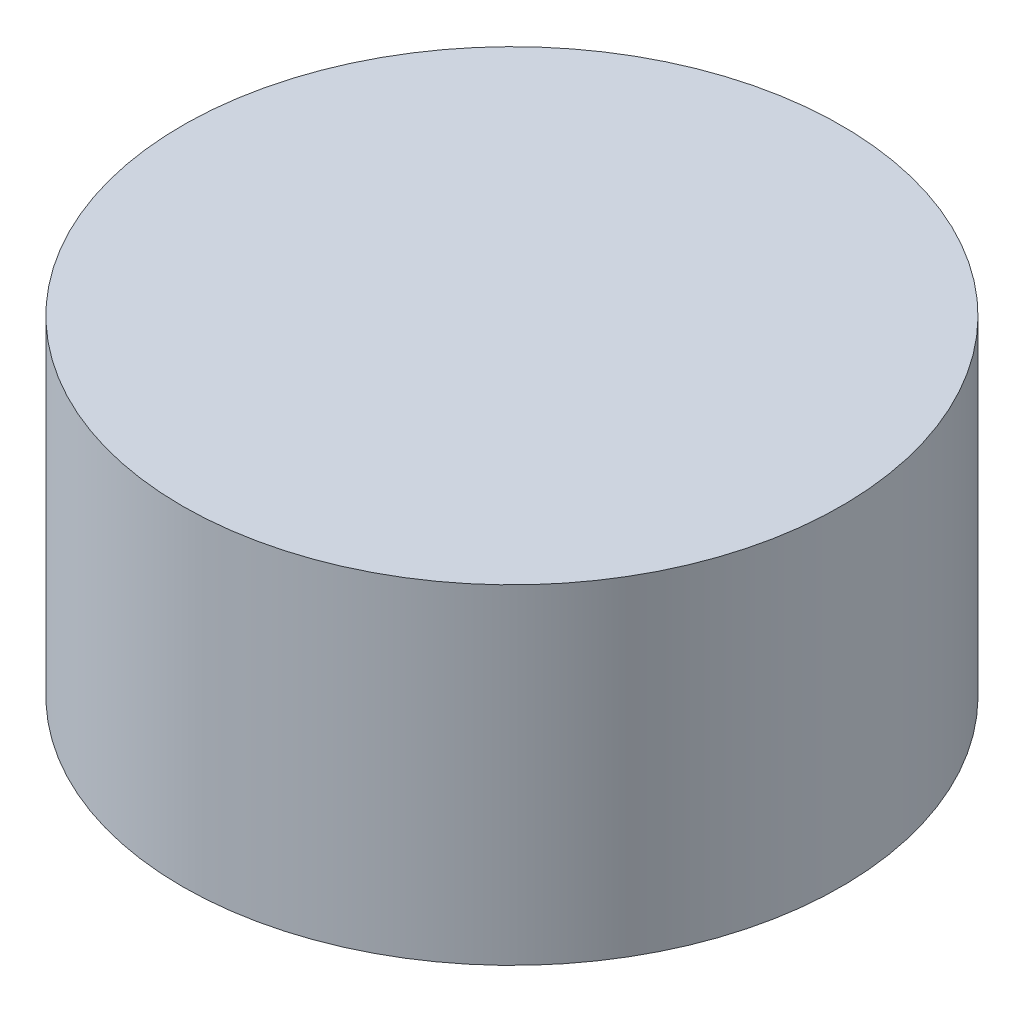
ISO-10303-21;
HEADER;
FILE_DESCRIPTION(('STEP AP214'),'2;1');
FILE_NAME('part.step','',(''),(''),'','','');
FILE_SCHEMA(('AUTOMOTIVE_DESIGN { 1 0 10303 214 1 1 1 1 }'));
ENDSEC;
DATA;
#1=APPLICATION_CONTEXT('core data for automotive mechanical design processes');
#2=APPLICATION_PROTOCOL_DEFINITION('international standard','automotive_design',2000,#1);
#3=PRODUCT_CONTEXT('',#1,'mechanical');
#4=PRODUCT('Part','Part','',(#3));
#5=PRODUCT_RELATED_PRODUCT_CATEGORY('part','',(#4));
#6=PRODUCT_DEFINITION_FORMATION('','',#4);
#7=PRODUCT_DEFINITION_CONTEXT('part definition',#1,'design');
#8=PRODUCT_DEFINITION('design','',#6,#7);
#9=PRODUCT_DEFINITION_SHAPE('','',#8);
#10=(LENGTH_UNIT() NAMED_UNIT(*) SI_UNIT(.MILLI.,.METRE.));
#11=(NAMED_UNIT(*) PLANE_ANGLE_UNIT() SI_UNIT($,.RADIAN.));
#12=(NAMED_UNIT(*) SI_UNIT($,.STERADIAN.) SOLID_ANGLE_UNIT());
#13=UNCERTAINTY_MEASURE_WITH_UNIT(LENGTH_MEASURE(1.E-05),#10,'distance_accuracy_value','');
#14=(GEOMETRIC_REPRESENTATION_CONTEXT(3) GLOBAL_UNCERTAINTY_ASSIGNED_CONTEXT((#13)) GLOBAL_UNIT_ASSIGNED_CONTEXT((#10,
#11,#12)) REPRESENTATION_CONTEXT('',''));
#15=CARTESIAN_POINT('',(0.,0.,0.));
#16=DIRECTION('',(0.,0.,1.));
#17=DIRECTION('',(1.,0.,0.));
#18=AXIS2_PLACEMENT_3D('',#15,#16,#17);
#19=CARTESIAN_POINT('',(0.,50.,0.));
#20=DIRECTION('',(0.,-1.,0.));
#21=DIRECTION('',(0.,0.,-1.));
#22=AXIS2_PLACEMENT_3D('',#19,#20,#21);
#23=CYLINDRICAL_SURFACE('',#22,50.);
#24=CARTESIAN_POINT('',(0.,50.,0.));
#25=DIRECTION('',(0.,1.,0.));
#26=DIRECTION('',(0.,0.,1.));
#27=AXIS2_PLACEMENT_3D('',#24,#25,#26);
#28=CIRCLE('',#27,50.);
#29=CARTESIAN_POINT('',(0.,50.,50.));
#30=VERTEX_POINT('',#29);
#31=EDGE_CURVE('E10',#30,#30,#28,.T.);
#32=ORIENTED_EDGE('',*,*,#31,.F.);
#33=EDGE_LOOP('',(#32));
#34=FACE_BOUND('',#33,.T.);
#35=CARTESIAN_POINT('',(0.,0.,0.));
#36=DIRECTION('',(0.,1.,0.));
#37=DIRECTION('',(0.,0.,1.));
#38=AXIS2_PLACEMENT_3D('',#35,#36,#37);
#39=CIRCLE('',#38,50.);
#40=CARTESIAN_POINT('',(0.,0.,50.));
#41=VERTEX_POINT('',#40);
#42=EDGE_CURVE('E35',#41,#41,#39,.T.);
#43=ORIENTED_EDGE('',*,*,#42,.T.);
#44=EDGE_LOOP('',(#43));
#45=FACE_BOUND('',#44,.T.);
#46=ADVANCED_FACE('F31',(#34,#45),#23,.T.);
#47=CARTESIAN_POINT('',(0.,50.,0.));
#48=DIRECTION('',(0.,1.,0.));
#49=DIRECTION('',(0.,0.,1.));
#50=AXIS2_PLACEMENT_3D('',#47,#48,#49);
#51=PLANE('',#50);
#52=ORIENTED_EDGE('',*,*,#31,.T.);
#53=EDGE_LOOP('',(#52));
#54=FACE_BOUND('',#53,.T.);
#55=ADVANCED_FACE('F60',(#54),#51,.T.);
#56=CARTESIAN_POINT('',(0.,0.,0.));
#57=DIRECTION('',(0.,-1.,0.));
#58=DIRECTION('',(0.,0.,-1.));
#59=AXIS2_PLACEMENT_3D('',#56,#57,#58);
#60=PLANE('',#59);
#61=CARTESIAN_POINT('',(0.,0.,0.));
#62=DIRECTION('',(0.,-1.,0.));
#63=DIRECTION('',(0.,0.,-1.));
#64=AXIS2_PLACEMENT_3D('',#61,#62,#63);
#65=CIRCLE('',#64,30.);
#66=CARTESIAN_POINT('',(0.,0.,-30.));
#67=VERTEX_POINT('',#66);
#68=EDGE_CURVE('E44',#67,#67,#65,.T.);
#69=ORIENTED_EDGE('',*,*,#68,.F.);
#70=EDGE_LOOP('',(#69));
#71=FACE_BOUND('',#70,.T.);
#72=ORIENTED_EDGE('',*,*,#42,.F.);
#73=EDGE_LOOP('',(#72));
#74=FACE_BOUND('',#73,.T.);
#75=ADVANCED_FACE('F33',(#71,#74),#60,.T.);
#76=CARTESIAN_POINT('',(0.,30.,0.));
#77=DIRECTION('',(0.,-1.,0.));
#78=DIRECTION('',(0.,0.,-1.));
#79=AXIS2_PLACEMENT_3D('',#76,#77,#78);
#80=CYLINDRICAL_SURFACE('',#79,30.);
#81=CARTESIAN_POINT('',(0.,30.,0.));
#82=DIRECTION('',(0.,-1.,0.));
#83=DIRECTION('',(0.,0.,-1.));
#84=AXIS2_PLACEMENT_3D('',#81,#82,#83);
#85=CIRCLE('',#84,30.);
#86=CARTESIAN_POINT('',(0.,30.,-30.));
#87=VERTEX_POINT('',#86);
#88=EDGE_CURVE('E42',#87,#87,#85,.T.);
#89=ORIENTED_EDGE('',*,*,#88,.F.);
#90=EDGE_LOOP('',(#89));
#91=FACE_BOUND('',#90,.T.);
#92=ORIENTED_EDGE('',*,*,#68,.T.);
#93=EDGE_LOOP('',(#92));
#94=FACE_BOUND('',#93,.T.);
#95=ADVANCED_FACE('F52',(#91,#94),#80,.F.);
#96=CARTESIAN_POINT('',(0.,30.,0.));
#97=DIRECTION('',(0.,-1.,0.));
#98=DIRECTION('',(0.,0.,-1.));
#99=AXIS2_PLACEMENT_3D('',#96,#97,#98);
#100=PLANE('',#99);
#101=ORIENTED_EDGE('',*,*,#88,.T.);
#102=EDGE_LOOP('',(#101));
#103=FACE_BOUND('',#102,.T.);
#104=ADVANCED_FACE('F50',(#103),#100,.T.);
#105=CLOSED_SHELL('',(#46,#55,#75,#95,#104));
#106=MANIFOLD_SOLID_BREP('B2',#105);
#107=ADVANCED_BREP_SHAPE_REPRESENTATION('',(#18,#106),#14);
#108=SHAPE_DEFINITION_REPRESENTATION(#9,#107);
ENDSEC;
END-ISO-10303-21;
